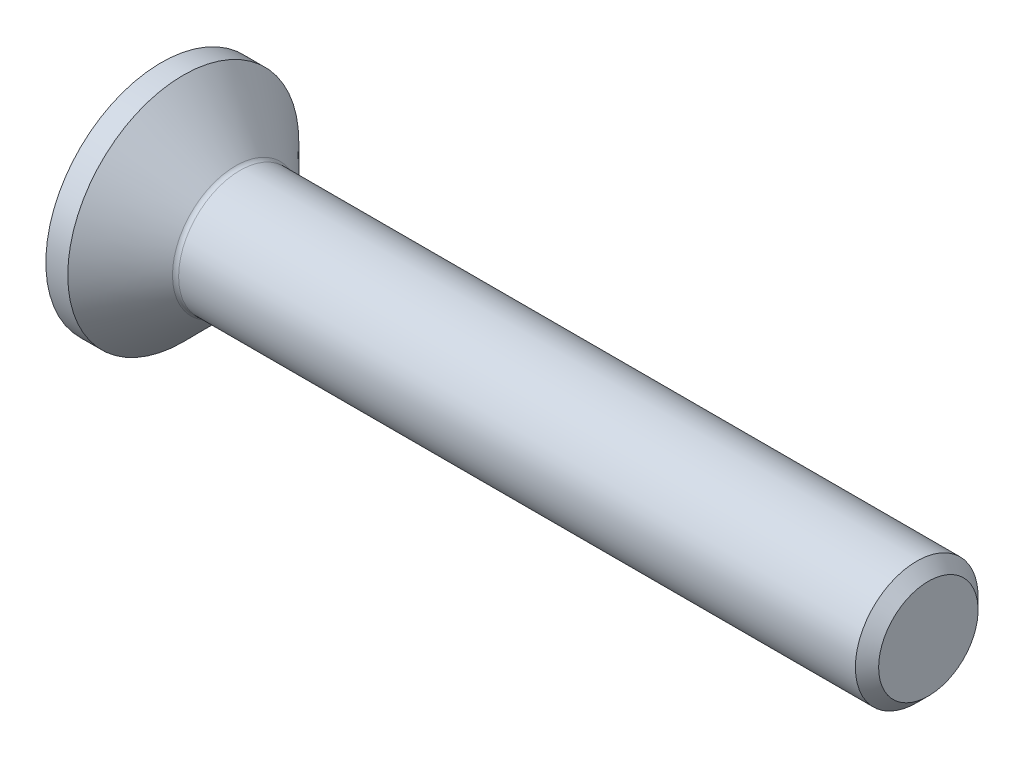
ISO-10303-21;
HEADER;
FILE_DESCRIPTION(('STEP AP214'),'2;1');
FILE_NAME('part.step','',(''),(''),'','','');
FILE_SCHEMA(('AUTOMOTIVE_DESIGN { 1 0 10303 214 1 1 1 1 }'));
ENDSEC;
DATA;
#1=APPLICATION_CONTEXT('core data for automotive mechanical design processes');
#2=APPLICATION_PROTOCOL_DEFINITION('international standard','automotive_design',2000,#1);
#3=PRODUCT_CONTEXT('',#1,'mechanical');
#4=PRODUCT('Part','Part','',(#3));
#5=PRODUCT_RELATED_PRODUCT_CATEGORY('part','',(#4));
#6=PRODUCT_DEFINITION_FORMATION('','',#4);
#7=PRODUCT_DEFINITION_CONTEXT('part definition',#1,'design');
#8=PRODUCT_DEFINITION('design','',#6,#7);
#9=PRODUCT_DEFINITION_SHAPE('','',#8);
#10=(LENGTH_UNIT() NAMED_UNIT(*) SI_UNIT(.MILLI.,.METRE.));
#11=(NAMED_UNIT(*) PLANE_ANGLE_UNIT() SI_UNIT($,.RADIAN.));
#12=(NAMED_UNIT(*) SI_UNIT($,.STERADIAN.) SOLID_ANGLE_UNIT());
#13=UNCERTAINTY_MEASURE_WITH_UNIT(LENGTH_MEASURE(1.E-05),#10,'distance_accuracy_value','');
#14=(GEOMETRIC_REPRESENTATION_CONTEXT(3) GLOBAL_UNCERTAINTY_ASSIGNED_CONTEXT((#13)) GLOBAL_UNIT_ASSIGNED_CONTEXT((#10,
#11,#12)) REPRESENTATION_CONTEXT('',''));
#15=CARTESIAN_POINT('',(0.,0.,0.));
#16=DIRECTION('',(0.,0.,1.));
#17=DIRECTION('',(1.,0.,0.));
#18=AXIS2_PLACEMENT_3D('',#15,#16,#17);
#19=CARTESIAN_POINT('',(25.,2.,0.));
#20=DIRECTION('',(-1.,0.,0.));
#21=DIRECTION('',(0.,0.,1.));
#22=AXIS2_PLACEMENT_3D('',#19,#20,#21);
#23=PLANE('',#22);
#24=CARTESIAN_POINT('',(25.,0.,0.));
#25=DIRECTION('',(-1.,0.,0.));
#26=DIRECTION('',(0.,0.,1.));
#27=AXIS2_PLACEMENT_3D('',#24,#25,#26);
#28=CIRCLE('',#27,1.62099999999999);
#29=CARTESIAN_POINT('',(25.,0.,1.62099999999999));
#30=VERTEX_POINT('',#29);
#31=EDGE_CURVE('E11',#30,#30,#28,.F.);
#32=ORIENTED_EDGE('',*,*,#31,.T.);
#33=EDGE_LOOP('',(#32));
#34=FACE_BOUND('',#33,.T.);
#35=ADVANCED_FACE('F38',(#34),#23,.F.);
#36=CARTESIAN_POINT('',(-0.587069180985524,0.,0.));
#37=DIRECTION('',(-1.,0.,0.));
#38=DIRECTION('',(0.,0.,1.));
#39=AXIS2_PLACEMENT_3D('',#36,#37,#38);
#40=CYLINDRICAL_SURFACE('',#39,2.);
#41=CARTESIAN_POINT('',(24.621,0.,0.));
#42=DIRECTION('',(-1.,0.,0.));
#43=DIRECTION('',(0.,0.,1.));
#44=AXIS2_PLACEMENT_3D('',#41,#42,#43);
#45=CIRCLE('',#44,2.);
#46=CARTESIAN_POINT('',(24.621,0.,2.));
#47=VERTEX_POINT('',#46);
#48=EDGE_CURVE('E47',#47,#47,#45,.T.);
#49=ORIENTED_EDGE('',*,*,#48,.T.);
#50=EDGE_LOOP('',(#49));
#51=FACE_BOUND('',#50,.T.);
#52=CARTESIAN_POINT('',(2.56284271247462,0.,0.));
#53=DIRECTION('',(-1.,0.,0.));
#54=DIRECTION('',(0.,0.,1.));
#55=AXIS2_PLACEMENT_3D('',#52,#53,#54);
#56=CIRCLE('',#55,2.);
#57=CARTESIAN_POINT('',(2.56284271247462,0.,2.));
#58=VERTEX_POINT('',#57);
#59=EDGE_CURVE('E151',#58,#58,#56,.F.);
#60=ORIENTED_EDGE('',*,*,#59,.T.);
#61=EDGE_LOOP('',(#60));
#62=FACE_BOUND('',#61,.T.);
#63=ADVANCED_FACE('F129',(#51,#62),#40,.T.);
#64=CARTESIAN_POINT('',(2.48,0.,0.));
#65=DIRECTION('',(-1.,0.,0.));
#66=DIRECTION('',(0.,0.,1.));
#67=AXIS2_PLACEMENT_3D('',#64,#65,#66);
#68=CONICAL_SURFACE('',#67,2.,0.785398163397448);
#69=CARTESIAN_POINT('',(0.714999999999996,0.,0.));
#70=DIRECTION('',(-1.,0.,0.));
#71=DIRECTION('',(0.,0.,1.));
#72=AXIS2_PLACEMENT_3D('',#69,#70,#71);
#73=CIRCLE('',#72,3.765);
#74=CARTESIAN_POINT('',(0.714999999999996,0.,3.765));
#75=VERTEX_POINT('',#74);
#76=EDGE_CURVE('E42',#75,#75,#73,.F.);
#77=ORIENTED_EDGE('',*,*,#76,.T.);
#78=EDGE_LOOP('',(#77));
#79=FACE_BOUND('',#78,.T.);
#80=CARTESIAN_POINT('',(2.42142135623731,0.,0.));
#81=DIRECTION('',(-1.,0.,0.));
#82=DIRECTION('',(0.,0.,1.));
#83=AXIS2_PLACEMENT_3D('',#80,#81,#82);
#84=CIRCLE('',#83,2.05857864376269);
#85=CARTESIAN_POINT('',(2.42142135623731,0.,2.05857864376269));
#86=VERTEX_POINT('',#85);
#87=EDGE_CURVE('E154',#86,#86,#84,.T.);
#88=ORIENTED_EDGE('',*,*,#87,.T.);
#89=EDGE_LOOP('',(#88));
#90=FACE_BOUND('',#89,.T.);
#91=ADVANCED_FACE('F135',(#79,#90),#68,.T.);
#92=CARTESIAN_POINT('',(2.56284271247462,0.,0.));
#93=DIRECTION('',(-1.,0.,0.));
#94=DIRECTION('',(0.,0.,1.));
#95=AXIS2_PLACEMENT_3D('',#92,#93,#94);
#96=TOROIDAL_SURFACE('',#95,2.2,0.2);
#97=ORIENTED_EDGE('',*,*,#59,.F.);
#98=EDGE_LOOP('',(#97));
#99=FACE_BOUND('',#98,.T.);
#100=ORIENTED_EDGE('',*,*,#87,.F.);
#101=EDGE_LOOP('',(#100));
#102=FACE_BOUND('',#101,.T.);
#103=ADVANCED_FACE('F139',(#99,#102),#96,.F.);
#104=CARTESIAN_POINT('',(24.621,0.,0.));
#105=DIRECTION('',(-1.,0.,0.));
#106=DIRECTION('',(0.,0.,1.));
#107=AXIS2_PLACEMENT_3D('',#104,#105,#106);
#108=CONICAL_SURFACE('',#107,2.,0.785398163397448);
#109=ORIENTED_EDGE('',*,*,#31,.F.);
#110=EDGE_LOOP('',(#109));
#111=FACE_BOUND('',#110,.T.);
#112=ORIENTED_EDGE('',*,*,#48,.F.);
#113=EDGE_LOOP('',(#112));
#114=FACE_BOUND('',#113,.T.);
#115=ADVANCED_FACE('F40',(#111,#114),#108,.T.);
#116=CARTESIAN_POINT('',(11.8531386861314,0.,0.));
#117=DIRECTION('',(1.,0.,0.));
#118=DIRECTION('',(0.,0.,-1.));
#119=AXIS2_PLACEMENT_3D('',#116,#117,#118);
#120=CYLINDRICAL_SURFACE('',#119,3.765);
#121=ORIENTED_EDGE('',*,*,#76,.F.);
#122=EDGE_LOOP('',(#121));
#123=FACE_BOUND('',#122,.T.);
#124=CARTESIAN_POINT('',(0.,0.,0.));
#125=DIRECTION('',(1.,0.,0.));
#126=DIRECTION('',(0.,0.,-1.));
#127=AXIS2_PLACEMENT_3D('',#124,#125,#126);
#128=CIRCLE('',#127,3.765);
#129=CARTESIAN_POINT('',(0.,0.,-3.765));
#130=VERTEX_POINT('',#129);
#131=EDGE_CURVE('E221',#130,#130,#128,.F.);
#132=ORIENTED_EDGE('',*,*,#131,.F.);
#133=EDGE_LOOP('',(#132));
#134=FACE_BOUND('',#133,.T.);
#135=ADVANCED_FACE('F116',(#123,#134),#120,.T.);
#136=CARTESIAN_POINT('',(2.22168783648704,0.,0.));
#137=DIRECTION('',(-1.,0.,0.));
#138=DIRECTION('',(0.,0.,1.));
#139=AXIS2_PLACEMENT_3D('',#136,#137,#138);
#140=CONICAL_SURFACE('',#139,0.,1.0471975511966);
#141=CARTESIAN_POINT('',(1.5,0.,0.));
#142=DIRECTION('',(-1.,0.,0.));
#143=DIRECTION('',(0.,0.,1.));
#144=AXIS2_PLACEMENT_3D('',#141,#142,#143);
#145=CIRCLE('',#144,1.25);
#146=CARTESIAN_POINT('',(1.5,0.625,1.08253175473055));
#147=VERTEX_POINT('',#146);
#148=CARTESIAN_POINT('',(1.5,1.25,0.));
#149=VERTEX_POINT('',#148);
#150=EDGE_CURVE('E161',#147,#149,#145,.T.);
#151=ORIENTED_EDGE('',*,*,#150,.T.);
#152=CARTESIAN_POINT('',(1.5,0.625000000000001,-1.08253175473055));
#153=VERTEX_POINT('',#152);
#154=EDGE_CURVE('E156',#149,#153,#145,.T.);
#155=ORIENTED_EDGE('',*,*,#154,.T.);
#156=CARTESIAN_POINT('',(1.5,-0.625,-1.08253175473055));
#157=VERTEX_POINT('',#156);
#158=EDGE_CURVE('E159',#153,#157,#145,.T.);
#159=ORIENTED_EDGE('',*,*,#158,.T.);
#160=CARTESIAN_POINT('',(1.5,-1.25,0.));
#161=VERTEX_POINT('',#160);
#162=EDGE_CURVE('E246',#157,#161,#145,.T.);
#163=ORIENTED_EDGE('',*,*,#162,.T.);
#164=CARTESIAN_POINT('',(1.5,-0.625,1.08253175473055));
#165=VERTEX_POINT('',#164);
#166=EDGE_CURVE('E54',#161,#165,#145,.T.);
#167=ORIENTED_EDGE('',*,*,#166,.T.);
#168=EDGE_CURVE('E170',#165,#147,#145,.T.);
#169=ORIENTED_EDGE('',*,*,#168,.T.);
#170=EDGE_LOOP('',(#151,#155,#159,#163,#167,#169));
#171=FACE_BOUND('',#170,.T.);
#172=CARTESIAN_POINT('',(2.22168783648704,0.,0.));
#173=VERTEX_POINT('',#172);
#174=VERTEX_LOOP('',#173);
#175=FACE_BOUND('',#174,.T.);
#176=ADVANCED_FACE('F113',(#171,#175),#140,.F.);
#177=CARTESIAN_POINT('',(1.5,0.,-1.44337567297406));
#178=DIRECTION('',(1.,0.,0.));
#179=DIRECTION('',(0.,0.,-1.));
#180=AXIS2_PLACEMENT_3D('',#177,#178,#179);
#181=PLANE('',#180);
#182=ORIENTED_EDGE('',*,*,#166,.F.);
#183=DIRECTION('',(0.,0.,-1.));
#184=VECTOR('',#183,1.);
#185=CARTESIAN_POINT('',(1.5,-1.25,0.721687836487032));
#186=LINE('',#185,#184);
#187=CARTESIAN_POINT('',(1.5,-1.25,0.721687836487032));
#188=VERTEX_POINT('',#187);
#189=EDGE_CURVE('E181',#188,#161,#186,.T.);
#190=ORIENTED_EDGE('',*,*,#189,.F.);
#191=DIRECTION('',(0.,-0.866025403784438,-0.5));
#192=VECTOR('',#191,1.);
#193=CARTESIAN_POINT('',(1.5,0.,1.44337567297406));
#194=LINE('',#193,#192);
#195=EDGE_CURVE('E205',#165,#188,#194,.T.);
#196=ORIENTED_EDGE('',*,*,#195,.F.);
#197=EDGE_LOOP('',(#182,#190,#196));
#198=FACE_BOUND('',#197,.T.);
#199=ADVANCED_FACE('F115',(#198),#181,.F.);
#200=ORIENTED_EDGE('',*,*,#168,.F.);
#201=CARTESIAN_POINT('',(1.5,0.,1.44337567297406));
#202=VERTEX_POINT('',#201);
#203=EDGE_CURVE('E202',#202,#165,#194,.T.);
#204=ORIENTED_EDGE('',*,*,#203,.F.);
#205=DIRECTION('',(0.,-0.866025403784439,0.5));
#206=VECTOR('',#205,1.);
#207=CARTESIAN_POINT('',(1.5,1.25,0.721687836487032));
#208=LINE('',#207,#206);
#209=EDGE_CURVE('E209',#147,#202,#208,.T.);
#210=ORIENTED_EDGE('',*,*,#209,.F.);
#211=EDGE_LOOP('',(#200,#204,#210));
#212=FACE_BOUND('',#211,.T.);
#213=ADVANCED_FACE('F122',(#212),#181,.F.);
#214=ORIENTED_EDGE('',*,*,#150,.F.);
#215=CARTESIAN_POINT('',(1.5,1.25,0.721687836487032));
#216=VERTEX_POINT('',#215);
#217=EDGE_CURVE('E206',#216,#147,#208,.T.);
#218=ORIENTED_EDGE('',*,*,#217,.F.);
#219=DIRECTION('',(0.,0.,1.));
#220=VECTOR('',#219,1.);
#221=CARTESIAN_POINT('',(1.5,1.25,-0.721687836487031));
#222=LINE('',#221,#220);
#223=EDGE_CURVE('E213',#149,#216,#222,.T.);
#224=ORIENTED_EDGE('',*,*,#223,.F.);
#225=EDGE_LOOP('',(#214,#218,#224));
#226=FACE_BOUND('',#225,.T.);
#227=ADVANCED_FACE('F277',(#226),#181,.F.);
#228=ORIENTED_EDGE('',*,*,#154,.F.);
#229=CARTESIAN_POINT('',(1.5,1.25,-0.721687836487031));
#230=VERTEX_POINT('',#229);
#231=EDGE_CURVE('E210',#230,#149,#222,.T.);
#232=ORIENTED_EDGE('',*,*,#231,.F.);
#233=DIRECTION('',(0.,0.866025403784438,0.5));
#234=VECTOR('',#233,1.);
#235=CARTESIAN_POINT('',(1.5,0.,-1.44337567297406));
#236=LINE('',#235,#234);
#237=EDGE_CURVE('E217',#153,#230,#236,.T.);
#238=ORIENTED_EDGE('',*,*,#237,.F.);
#239=EDGE_LOOP('',(#228,#232,#238));
#240=FACE_BOUND('',#239,.T.);
#241=ADVANCED_FACE('F282',(#240),#181,.F.);
#242=ORIENTED_EDGE('',*,*,#158,.F.);
#243=CARTESIAN_POINT('',(1.5,0.,-1.44337567297406));
#244=VERTEX_POINT('',#243);
#245=EDGE_CURVE('E214',#244,#153,#236,.T.);
#246=ORIENTED_EDGE('',*,*,#245,.F.);
#247=DIRECTION('',(0.,0.866025403784439,-0.5));
#248=VECTOR('',#247,1.);
#249=CARTESIAN_POINT('',(1.5,-1.25,-0.721687836487033));
#250=LINE('',#249,#248);
#251=EDGE_CURVE('E185',#157,#244,#250,.T.);
#252=ORIENTED_EDGE('',*,*,#251,.F.);
#253=EDGE_LOOP('',(#242,#246,#252));
#254=FACE_BOUND('',#253,.T.);
#255=ADVANCED_FACE('F251',(#254),#181,.F.);
#256=ORIENTED_EDGE('',*,*,#162,.F.);
#257=CARTESIAN_POINT('',(1.5,-1.25,-0.721687836487033));
#258=VERTEX_POINT('',#257);
#259=EDGE_CURVE('E218',#258,#157,#250,.T.);
#260=ORIENTED_EDGE('',*,*,#259,.F.);
#261=EDGE_CURVE('E201',#161,#258,#186,.T.);
#262=ORIENTED_EDGE('',*,*,#261,.F.);
#263=EDGE_LOOP('',(#256,#260,#262));
#264=FACE_BOUND('',#263,.T.);
#265=ADVANCED_FACE('F125',(#264),#181,.F.);
#266=CARTESIAN_POINT('',(1.5,-1.25,0.721687836487032));
#267=DIRECTION('',(0.,1.,0.));
#268=DIRECTION('',(0.,0.,1.));
#269=AXIS2_PLACEMENT_3D('',#266,#267,#268);
#270=PLANE('',#269);
#271=DIRECTION('',(0.,0.,-1.));
#272=VECTOR('',#271,1.);
#273=CARTESIAN_POINT('',(0.,-1.25,0.721687836487032));
#274=LINE('',#273,#272);
#275=CARTESIAN_POINT('',(0.,-1.25,0.721687836487032));
#276=VERTEX_POINT('',#275);
#277=CARTESIAN_POINT('',(0.,-1.25,-0.721687836487033));
#278=VERTEX_POINT('',#277);
#279=EDGE_CURVE('E182',#276,#278,#274,.T.);
#280=ORIENTED_EDGE('',*,*,#279,.F.);
#281=DIRECTION('',(-1.,0.,0.));
#282=VECTOR('',#281,1.);
#283=CARTESIAN_POINT('',(1.5,-1.25,0.721687836487032));
#284=LINE('',#283,#282);
#285=EDGE_CURVE('E177',#188,#276,#284,.T.);
#286=ORIENTED_EDGE('',*,*,#285,.F.);
#287=ORIENTED_EDGE('',*,*,#189,.T.);
#288=ORIENTED_EDGE('',*,*,#261,.T.);
#289=DIRECTION('',(-1.,0.,0.));
#290=VECTOR('',#289,1.);
#291=CARTESIAN_POINT('',(1.5,-1.25,-0.721687836487033));
#292=LINE('',#291,#290);
#293=EDGE_CURVE('E179',#258,#278,#292,.T.);
#294=ORIENTED_EDGE('',*,*,#293,.T.);
#295=EDGE_LOOP('',(#280,#286,#287,#288,#294));
#296=FACE_BOUND('',#295,.T.);
#297=ADVANCED_FACE('F240',(#296),#270,.T.);
#298=CARTESIAN_POINT('',(1.5,0.,1.44337567297406));
#299=DIRECTION('',(0.,0.5,-0.866025403784438));
#300=DIRECTION('',(0.,0.866025403784438,0.5));
#301=AXIS2_PLACEMENT_3D('',#298,#299,#300);
#302=PLANE('',#301);
#303=DIRECTION('',(0.,-0.866025403784438,-0.5));
#304=VECTOR('',#303,1.);
#305=CARTESIAN_POINT('',(0.,0.,1.44337567297406));
#306=LINE('',#305,#304);
#307=CARTESIAN_POINT('',(0.,0.,1.44337567297406));
#308=VERTEX_POINT('',#307);
#309=EDGE_CURVE('E186',#308,#276,#306,.T.);
#310=ORIENTED_EDGE('',*,*,#309,.F.);
#311=DIRECTION('',(-1.,0.,0.));
#312=VECTOR('',#311,1.);
#313=CARTESIAN_POINT('',(1.5,0.,1.44337567297406));
#314=LINE('',#313,#312);
#315=EDGE_CURVE('E175',#202,#308,#314,.T.);
#316=ORIENTED_EDGE('',*,*,#315,.F.);
#317=ORIENTED_EDGE('',*,*,#203,.T.);
#318=ORIENTED_EDGE('',*,*,#195,.T.);
#319=ORIENTED_EDGE('',*,*,#285,.T.);
#320=EDGE_LOOP('',(#310,#316,#317,#318,#319));
#321=FACE_BOUND('',#320,.T.);
#322=ADVANCED_FACE('F270',(#321),#302,.T.);
#323=CARTESIAN_POINT('',(1.5,1.25,0.721687836487032));
#324=DIRECTION('',(0.,-0.5,-0.866025403784438));
#325=DIRECTION('',(0.,0.866025403784439,-0.5));
#326=AXIS2_PLACEMENT_3D('',#323,#324,#325);
#327=PLANE('',#326);
#328=DIRECTION('',(0.,-0.866025403784439,0.5));
#329=VECTOR('',#328,1.);
#330=CARTESIAN_POINT('',(0.,1.25,0.721687836487032));
#331=LINE('',#330,#329);
#332=CARTESIAN_POINT('',(0.,1.25,0.721687836487032));
#333=VERTEX_POINT('',#332);
#334=EDGE_CURVE('E189',#333,#308,#331,.T.);
#335=ORIENTED_EDGE('',*,*,#334,.F.);
#336=DIRECTION('',(-1.,0.,0.));
#337=VECTOR('',#336,1.);
#338=CARTESIAN_POINT('',(1.5,1.25,0.721687836487032));
#339=LINE('',#338,#337);
#340=EDGE_CURVE('E173',#216,#333,#339,.T.);
#341=ORIENTED_EDGE('',*,*,#340,.F.);
#342=ORIENTED_EDGE('',*,*,#217,.T.);
#343=ORIENTED_EDGE('',*,*,#209,.T.);
#344=ORIENTED_EDGE('',*,*,#315,.T.);
#345=EDGE_LOOP('',(#335,#341,#342,#343,#344));
#346=FACE_BOUND('',#345,.T.);
#347=ADVANCED_FACE('F264',(#346),#327,.T.);
#348=CARTESIAN_POINT('',(1.5,1.25,-0.721687836487031));
#349=DIRECTION('',(0.,-1.,0.));
#350=DIRECTION('',(0.,0.,-1.));
#351=AXIS2_PLACEMENT_3D('',#348,#349,#350);
#352=PLANE('',#351);
#353=DIRECTION('',(0.,0.,1.));
#354=VECTOR('',#353,1.);
#355=CARTESIAN_POINT('',(0.,1.25,-0.721687836487031));
#356=LINE('',#355,#354);
#357=CARTESIAN_POINT('',(0.,1.25,-0.721687836487031));
#358=VERTEX_POINT('',#357);
#359=EDGE_CURVE('E192',#358,#333,#356,.T.);
#360=ORIENTED_EDGE('',*,*,#359,.F.);
#361=DIRECTION('',(-1.,0.,0.));
#362=VECTOR('',#361,1.);
#363=CARTESIAN_POINT('',(1.5,1.25,-0.721687836487031));
#364=LINE('',#363,#362);
#365=EDGE_CURVE('E171',#230,#358,#364,.T.);
#366=ORIENTED_EDGE('',*,*,#365,.F.);
#367=ORIENTED_EDGE('',*,*,#231,.T.);
#368=ORIENTED_EDGE('',*,*,#223,.T.);
#369=ORIENTED_EDGE('',*,*,#340,.T.);
#370=EDGE_LOOP('',(#360,#366,#367,#368,#369));
#371=FACE_BOUND('',#370,.T.);
#372=ADVANCED_FACE('F260',(#371),#352,.T.);
#373=CARTESIAN_POINT('',(1.5,0.,-1.44337567297406));
#374=DIRECTION('',(0.,-0.5,0.866025403784438));
#375=DIRECTION('',(0.,-0.866025403784438,-0.5));
#376=AXIS2_PLACEMENT_3D('',#373,#374,#375);
#377=PLANE('',#376);
#378=DIRECTION('',(0.,0.866025403784438,0.5));
#379=VECTOR('',#378,1.);
#380=CARTESIAN_POINT('',(0.,0.,-1.44337567297406));
#381=LINE('',#380,#379);
#382=CARTESIAN_POINT('',(0.,0.,-1.44337567297406));
#383=VERTEX_POINT('',#382);
#384=EDGE_CURVE('E195',#383,#358,#381,.T.);
#385=ORIENTED_EDGE('',*,*,#384,.F.);
#386=DIRECTION('',(-1.,0.,0.));
#387=VECTOR('',#386,1.);
#388=CARTESIAN_POINT('',(1.5,0.,-1.44337567297406));
#389=LINE('',#388,#387);
#390=EDGE_CURVE('E163',#244,#383,#389,.T.);
#391=ORIENTED_EDGE('',*,*,#390,.F.);
#392=ORIENTED_EDGE('',*,*,#245,.T.);
#393=ORIENTED_EDGE('',*,*,#237,.T.);
#394=ORIENTED_EDGE('',*,*,#365,.T.);
#395=EDGE_LOOP('',(#385,#391,#392,#393,#394));
#396=FACE_BOUND('',#395,.T.);
#397=ADVANCED_FACE('F255',(#396),#377,.T.);
#398=CARTESIAN_POINT('',(1.5,-1.25,-0.721687836487033));
#399=DIRECTION('',(0.,0.5,0.866025403784438));
#400=DIRECTION('',(0.,-0.866025403784439,0.5));
#401=AXIS2_PLACEMENT_3D('',#398,#399,#400);
#402=PLANE('',#401);
#403=DIRECTION('',(0.,0.866025403784439,-0.5));
#404=VECTOR('',#403,1.);
#405=CARTESIAN_POINT('',(0.,-1.25,-0.721687836487033));
#406=LINE('',#405,#404);
#407=EDGE_CURVE('E62',#278,#383,#406,.T.);
#408=ORIENTED_EDGE('',*,*,#407,.F.);
#409=ORIENTED_EDGE('',*,*,#293,.F.);
#410=ORIENTED_EDGE('',*,*,#259,.T.);
#411=ORIENTED_EDGE('',*,*,#251,.T.);
#412=ORIENTED_EDGE('',*,*,#390,.T.);
#413=EDGE_LOOP('',(#408,#409,#410,#411,#412));
#414=FACE_BOUND('',#413,.T.);
#415=ADVANCED_FACE('F234',(#414),#402,.T.);
#416=CARTESIAN_POINT('',(0.,0.,0.));
#417=DIRECTION('',(1.,0.,0.));
#418=DIRECTION('',(0.,0.,-1.));
#419=AXIS2_PLACEMENT_3D('',#416,#417,#418);
#420=PLANE('',#419);
#421=ORIENTED_EDGE('',*,*,#131,.T.);
#422=EDGE_LOOP('',(#421));
#423=FACE_BOUND('',#422,.T.);
#424=ORIENTED_EDGE('',*,*,#407,.T.);
#425=ORIENTED_EDGE('',*,*,#384,.T.);
#426=ORIENTED_EDGE('',*,*,#359,.T.);
#427=ORIENTED_EDGE('',*,*,#334,.T.);
#428=ORIENTED_EDGE('',*,*,#309,.T.);
#429=ORIENTED_EDGE('',*,*,#279,.T.);
#430=EDGE_LOOP('',(#424,#425,#426,#427,#428,#429));
#431=FACE_BOUND('',#430,.T.);
#432=ADVANCED_FACE('F231',(#423,#431),#420,.F.);
#433=CLOSED_SHELL('',(#35,#63,#91,#103,#115,#135,#176,#199,#213,#227,#241,#255,#265,#297,#322,
#347,#372,#397,#415,#432));
#434=MANIFOLD_SOLID_BREP('B2',#433);
#435=ADVANCED_BREP_SHAPE_REPRESENTATION('',(#18,#434),#14);
#436=SHAPE_DEFINITION_REPRESENTATION(#9,#435);
ENDSEC;
END-ISO-10303-21;
